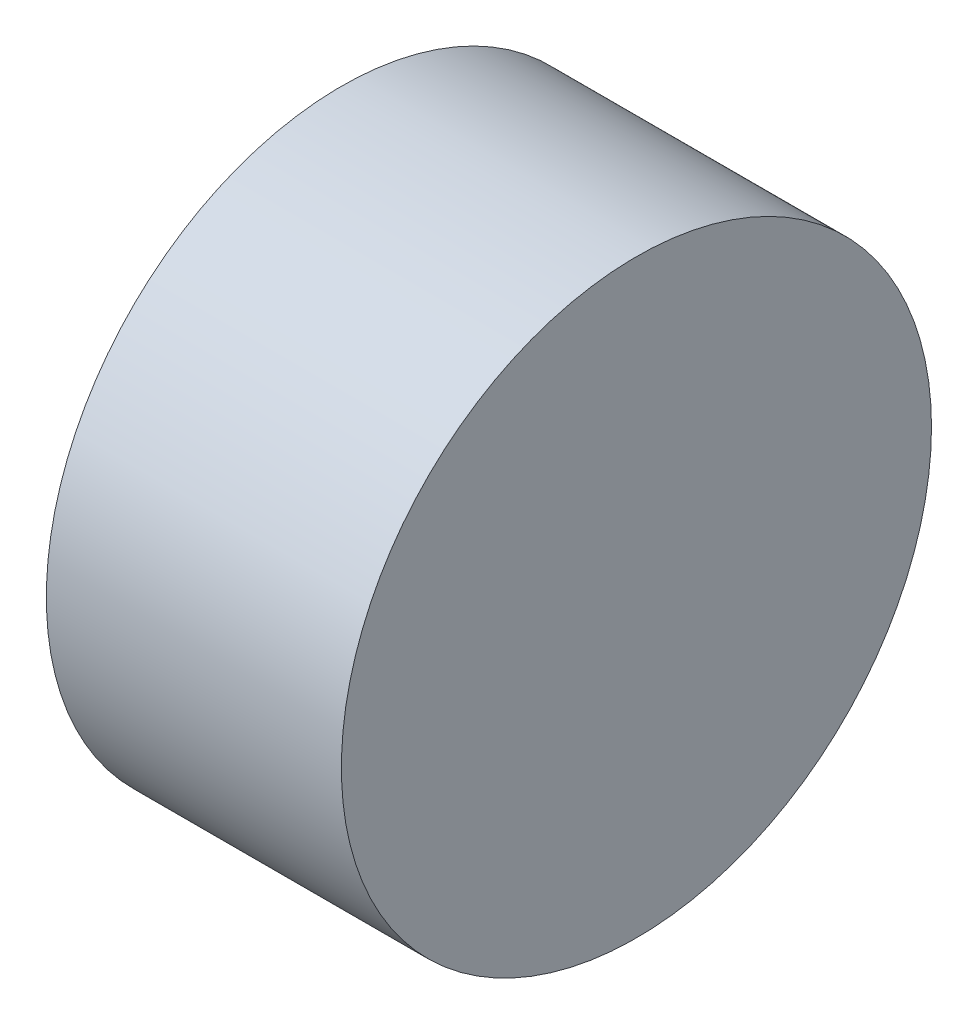
ISO-10303-21;
HEADER;
FILE_DESCRIPTION(('STEP AP214'),'2;1');
FILE_NAME('part.step','',(''),(''),'','','');
FILE_SCHEMA(('AUTOMOTIVE_DESIGN { 1 0 10303 214 1 1 1 1 }'));
ENDSEC;
DATA;
#1=APPLICATION_CONTEXT('core data for automotive mechanical design processes');
#2=APPLICATION_PROTOCOL_DEFINITION('international standard','automotive_design',2000,#1);
#3=PRODUCT_CONTEXT('',#1,'mechanical');
#4=PRODUCT('Part','Part','',(#3));
#5=PRODUCT_RELATED_PRODUCT_CATEGORY('part','',(#4));
#6=PRODUCT_DEFINITION_FORMATION('','',#4);
#7=PRODUCT_DEFINITION_CONTEXT('part definition',#1,'design');
#8=PRODUCT_DEFINITION('design','',#6,#7);
#9=PRODUCT_DEFINITION_SHAPE('','',#8);
#10=(LENGTH_UNIT() NAMED_UNIT(*) SI_UNIT(.MILLI.,.METRE.));
#11=(NAMED_UNIT(*) PLANE_ANGLE_UNIT() SI_UNIT($,.RADIAN.));
#12=(NAMED_UNIT(*) SI_UNIT($,.STERADIAN.) SOLID_ANGLE_UNIT());
#13=UNCERTAINTY_MEASURE_WITH_UNIT(LENGTH_MEASURE(1.E-05),#10,'distance_accuracy_value','');
#14=(GEOMETRIC_REPRESENTATION_CONTEXT(3) GLOBAL_UNCERTAINTY_ASSIGNED_CONTEXT((#13)) GLOBAL_UNIT_ASSIGNED_CONTEXT((#10,
#11,#12)) REPRESENTATION_CONTEXT('',''));
#15=CARTESIAN_POINT('',(0.,0.,0.));
#16=DIRECTION('',(0.,0.,1.));
#17=DIRECTION('',(1.,0.,0.));
#18=AXIS2_PLACEMENT_3D('',#15,#16,#17);
#19=CARTESIAN_POINT('',(0.,0.,0.));
#20=DIRECTION('',(1.,0.,0.));
#21=DIRECTION('',(0.,0.,-1.));
#22=AXIS2_PLACEMENT_3D('',#19,#20,#21);
#23=PLANE('',#22);
#24=CARTESIAN_POINT('',(0.,0.,0.));
#25=DIRECTION('',(1.,0.,0.));
#26=DIRECTION('',(0.,0.,-1.));
#27=AXIS2_PLACEMENT_3D('',#24,#25,#26);
#28=CIRCLE('',#27,30.);
#29=CARTESIAN_POINT('',(0.,0.,-30.));
#30=VERTEX_POINT('',#29);
#31=EDGE_CURVE('E10',#30,#30,#28,.T.);
#32=ORIENTED_EDGE('',*,*,#31,.F.);
#33=EDGE_LOOP('',(#32));
#34=FACE_BOUND('',#33,.T.);
#35=CARTESIAN_POINT('',(0.,0.,0.));
#36=DIRECTION('',(1.,0.,0.));
#37=DIRECTION('',(0.,0.,-1.));
#38=AXIS2_PLACEMENT_3D('',#35,#36,#37);
#39=CIRCLE('',#38,2.5);
#40=CARTESIAN_POINT('',(0.,0.,-2.5));
#41=VERTEX_POINT('',#40);
#42=EDGE_CURVE('E49',#41,#41,#39,.T.);
#43=ORIENTED_EDGE('',*,*,#42,.T.);
#44=EDGE_LOOP('',(#43));
#45=FACE_BOUND('',#44,.T.);
#46=ADVANCED_FACE('F41',(#34,#45),#23,.F.);
#47=CARTESIAN_POINT('',(10.,0.,0.));
#48=DIRECTION('',(-1.,0.,0.));
#49=DIRECTION('',(0.,0.,1.));
#50=AXIS2_PLACEMENT_3D('',#47,#48,#49);
#51=CYLINDRICAL_SURFACE('',#50,30.);
#52=ORIENTED_EDGE('',*,*,#31,.T.);
#53=EDGE_LOOP('',(#52));
#54=FACE_BOUND('',#53,.T.);
#55=CARTESIAN_POINT('',(30.,0.,0.));
#56=DIRECTION('',(1.,0.,0.));
#57=DIRECTION('',(0.,0.,-1.));
#58=AXIS2_PLACEMENT_3D('',#55,#56,#57);
#59=CIRCLE('',#58,30.);
#60=CARTESIAN_POINT('',(30.,0.,-30.));
#61=VERTEX_POINT('',#60);
#62=EDGE_CURVE('E59',#61,#61,#59,.T.);
#63=ORIENTED_EDGE('',*,*,#62,.F.);
#64=EDGE_LOOP('',(#63));
#65=FACE_BOUND('',#64,.T.);
#66=ADVANCED_FACE('F43',(#54,#65),#51,.T.);
#67=CARTESIAN_POINT('',(10.,0.,0.));
#68=DIRECTION('',(-1.,0.,0.));
#69=DIRECTION('',(0.,0.,1.));
#70=AXIS2_PLACEMENT_3D('',#67,#68,#69);
#71=CYLINDRICAL_SURFACE('',#70,2.5);
#72=CARTESIAN_POINT('',(10.,0.,0.));
#73=DIRECTION('',(1.,0.,0.));
#74=DIRECTION('',(0.,0.,-1.));
#75=AXIS2_PLACEMENT_3D('',#72,#73,#74);
#76=CIRCLE('',#75,2.5);
#77=CARTESIAN_POINT('',(10.,0.,-2.5));
#78=VERTEX_POINT('',#77);
#79=EDGE_CURVE('E54',#78,#78,#76,.T.);
#80=ORIENTED_EDGE('',*,*,#79,.T.);
#81=EDGE_LOOP('',(#80));
#82=FACE_BOUND('',#81,.T.);
#83=ORIENTED_EDGE('',*,*,#42,.F.);
#84=EDGE_LOOP('',(#83));
#85=FACE_BOUND('',#84,.T.);
#86=ADVANCED_FACE('F69',(#82,#85),#71,.F.);
#87=CARTESIAN_POINT('',(10.,0.,0.));
#88=DIRECTION('',(1.,0.,0.));
#89=DIRECTION('',(0.,0.,-1.));
#90=AXIS2_PLACEMENT_3D('',#87,#88,#89);
#91=PLANE('',#90);
#92=ORIENTED_EDGE('',*,*,#79,.F.);
#93=EDGE_LOOP('',(#92));
#94=FACE_BOUND('',#93,.T.);
#95=ADVANCED_FACE('F74',(#94),#91,.F.);
#96=CARTESIAN_POINT('',(30.,0.,0.));
#97=DIRECTION('',(1.,0.,0.));
#98=DIRECTION('',(0.,0.,-1.));
#99=AXIS2_PLACEMENT_3D('',#96,#97,#98);
#100=PLANE('',#99);
#101=ORIENTED_EDGE('',*,*,#62,.T.);
#102=EDGE_LOOP('',(#101));
#103=FACE_BOUND('',#102,.T.);
#104=ADVANCED_FACE('F66',(#103),#100,.T.);
#105=CLOSED_SHELL('',(#46,#66,#86,#95,#104));
#106=MANIFOLD_SOLID_BREP('B2',#105);
#107=ADVANCED_BREP_SHAPE_REPRESENTATION('',(#18,#106),#14);
#108=SHAPE_DEFINITION_REPRESENTATION(#9,#107);
ENDSEC;
END-ISO-10303-21;
